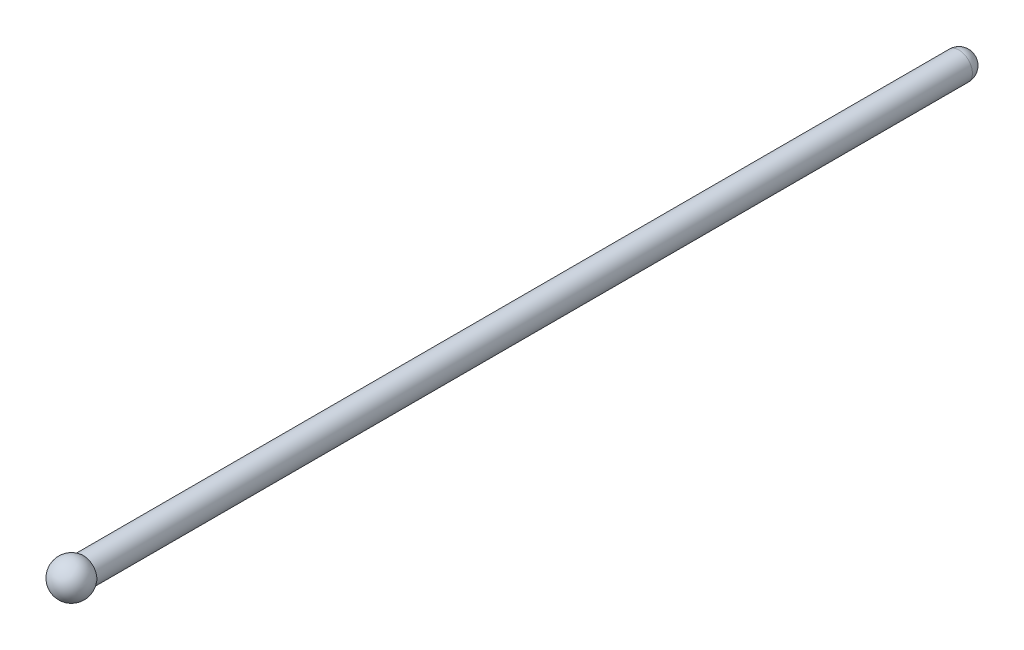
ISO-10303-21;
HEADER;
FILE_DESCRIPTION(('STEP AP214'),'2;1');
FILE_NAME('part.step','',(''),(''),'','','');
FILE_SCHEMA(('AUTOMOTIVE_DESIGN { 1 0 10303 214 1 1 1 1 }'));
ENDSEC;
DATA;
#1=APPLICATION_CONTEXT('core data for automotive mechanical design processes');
#2=APPLICATION_PROTOCOL_DEFINITION('international standard','automotive_design',2000,#1);
#3=PRODUCT_CONTEXT('',#1,'mechanical');
#4=PRODUCT('Part','Part','',(#3));
#5=PRODUCT_RELATED_PRODUCT_CATEGORY('part','',(#4));
#6=PRODUCT_DEFINITION_FORMATION('','',#4);
#7=PRODUCT_DEFINITION_CONTEXT('part definition',#1,'design');
#8=PRODUCT_DEFINITION('design','',#6,#7);
#9=PRODUCT_DEFINITION_SHAPE('','',#8);
#10=(LENGTH_UNIT() NAMED_UNIT(*) SI_UNIT(.MILLI.,.METRE.));
#11=(NAMED_UNIT(*) PLANE_ANGLE_UNIT() SI_UNIT($,.RADIAN.));
#12=(NAMED_UNIT(*) SI_UNIT($,.STERADIAN.) SOLID_ANGLE_UNIT());
#13=UNCERTAINTY_MEASURE_WITH_UNIT(LENGTH_MEASURE(1.E-05),#10,'distance_accuracy_value','');
#14=(GEOMETRIC_REPRESENTATION_CONTEXT(3) GLOBAL_UNCERTAINTY_ASSIGNED_CONTEXT((#13)) GLOBAL_UNIT_ASSIGNED_CONTEXT((#10,
#11,#12)) REPRESENTATION_CONTEXT('',''));
#15=CARTESIAN_POINT('',(0.,0.,0.));
#16=DIRECTION('',(0.,0.,1.));
#17=DIRECTION('',(1.,0.,0.));
#18=AXIS2_PLACEMENT_3D('',#15,#16,#17);
#19=CARTESIAN_POINT('',(0.,0.,50.));
#20=DIRECTION('',(0.,0.,-1.));
#21=DIRECTION('',(-1.,0.,0.));
#22=AXIS2_PLACEMENT_3D('',#19,#20,#21);
#23=CYLINDRICAL_SURFACE('',#22,0.75);
#24=CARTESIAN_POINT('',(0.,0.,0.750000000000001));
#25=DIRECTION('',(0.,0.,-1.));
#26=DIRECTION('',(-1.,0.,0.));
#27=AXIS2_PLACEMENT_3D('',#24,#25,#26);
#28=CIRCLE('',#27,0.75);
#29=CARTESIAN_POINT('',(-0.75,0.,0.750000000000001));
#30=VERTEX_POINT('',#29);
#31=EDGE_CURVE('E10',#30,#30,#28,.F.);
#32=ORIENTED_EDGE('',*,*,#31,.T.);
#33=EDGE_LOOP('',(#32));
#34=FACE_BOUND('',#33,.T.);
#35=CARTESIAN_POINT('',(0.,0.,49.3385621722339));
#36=DIRECTION('',(0.,0.,1.));
#37=DIRECTION('',(1.,0.,0.));
#38=AXIS2_PLACEMENT_3D('',#35,#36,#37);
#39=CIRCLE('',#38,0.75);
#40=CARTESIAN_POINT('',(0.75,0.,49.3385621722339));
#41=VERTEX_POINT('',#40);
#42=EDGE_CURVE('E51',#41,#41,#39,.T.);
#43=ORIENTED_EDGE('',*,*,#42,.F.);
#44=EDGE_LOOP('',(#43));
#45=FACE_BOUND('',#44,.T.);
#46=ADVANCED_FACE('F43',(#34,#45),#23,.T.);
#47=CARTESIAN_POINT('',(0.,0.,50.));
#48=DIRECTION('',(-1.,0.,0.));
#49=DIRECTION('',(0.,-1.,0.));
#50=AXIS2_PLACEMENT_3D('',#47,#48,#49);
#51=SPHERICAL_SURFACE('',#50,1.);
#52=CARTESIAN_POINT('',(0.,0.,50.));
#53=DIRECTION('',(0.,0.,1.));
#54=DIRECTION('',(1.,0.,0.));
#55=AXIS2_PLACEMENT_3D('',#52,#53,#54);
#56=SPHERICAL_SURFACE('',#55,1.);
#57=ORIENTED_EDGE('',*,*,#42,.T.);
#58=EDGE_LOOP('',(#57));
#59=FACE_BOUND('',#58,.T.);
#60=ADVANCED_FACE('F58',(#59),#56,.T.);
#61=CARTESIAN_POINT('',(0.,0.,0.750000000000001));
#62=DIRECTION('',(0.,0.,1.));
#63=DIRECTION('',(1.,0.,0.));
#64=AXIS2_PLACEMENT_3D('',#61,#62,#63);
#65=SPHERICAL_SURFACE('',#64,0.75);
#66=ORIENTED_EDGE('',*,*,#31,.F.);
#67=EDGE_LOOP('',(#66));
#68=FACE_BOUND('',#67,.T.);
#69=ADVANCED_FACE('F45',(#68),#65,.T.);
#70=CLOSED_SHELL('',(#46,#60,#69));
#71=MANIFOLD_SOLID_BREP('B2',#70);
#72=ADVANCED_BREP_SHAPE_REPRESENTATION('',(#18,#71),#14);
#73=SHAPE_DEFINITION_REPRESENTATION(#9,#72);
ENDSEC;
END-ISO-10303-21;
